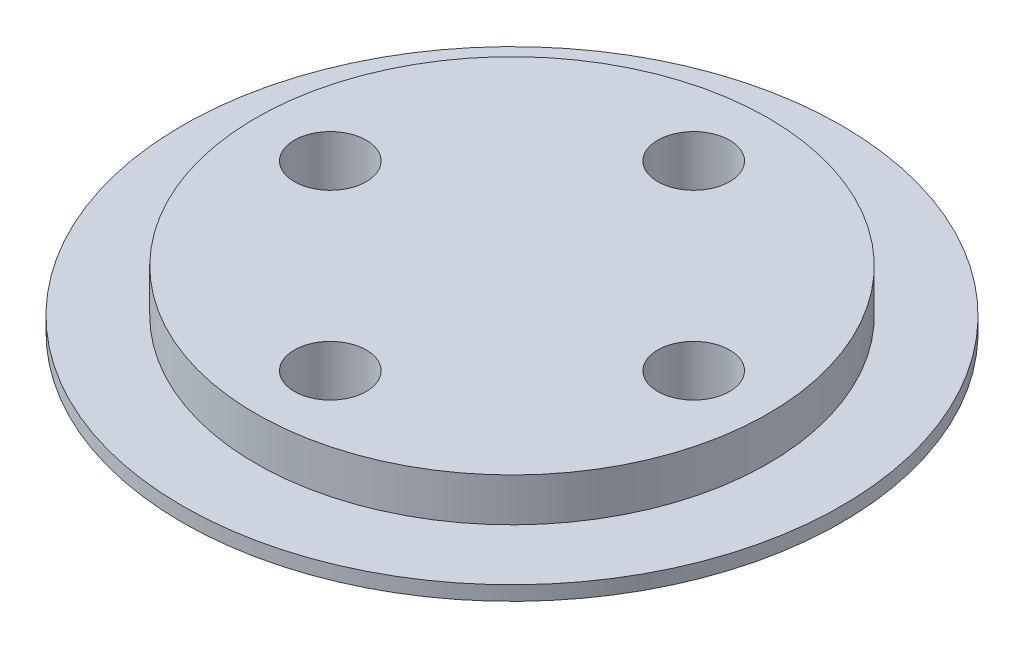
ISO-10303-21;
HEADER;
FILE_DESCRIPTION(('STEP AP214'),'2;1');
FILE_NAME('part.step','',(''),(''),'','','');
FILE_SCHEMA(('AUTOMOTIVE_DESIGN { 1 0 10303 214 1 1 1 1 }'));
ENDSEC;
DATA;
#1=APPLICATION_CONTEXT('core data for automotive mechanical design processes');
#2=APPLICATION_PROTOCOL_DEFINITION('international standard','automotive_design',2000,#1);
#3=PRODUCT_CONTEXT('',#1,'mechanical');
#4=PRODUCT('Part','Part','',(#3));
#5=PRODUCT_RELATED_PRODUCT_CATEGORY('part','',(#4));
#6=PRODUCT_DEFINITION_FORMATION('','',#4);
#7=PRODUCT_DEFINITION_CONTEXT('part definition',#1,'design');
#8=PRODUCT_DEFINITION('design','',#6,#7);
#9=PRODUCT_DEFINITION_SHAPE('','',#8);
#10=(LENGTH_UNIT() NAMED_UNIT(*) SI_UNIT(.MILLI.,.METRE.));
#11=(NAMED_UNIT(*) PLANE_ANGLE_UNIT() SI_UNIT($,.RADIAN.));
#12=(NAMED_UNIT(*) SI_UNIT($,.STERADIAN.) SOLID_ANGLE_UNIT());
#13=UNCERTAINTY_MEASURE_WITH_UNIT(LENGTH_MEASURE(1.E-05),#10,'distance_accuracy_value','');
#14=(GEOMETRIC_REPRESENTATION_CONTEXT(3) GLOBAL_UNCERTAINTY_ASSIGNED_CONTEXT((#13)) GLOBAL_UNIT_ASSIGNED_CONTEXT((#10,
#11,#12)) REPRESENTATION_CONTEXT('',''));
#15=CARTESIAN_POINT('',(0.,0.,0.));
#16=DIRECTION('',(0.,0.,1.));
#17=DIRECTION('',(1.,0.,0.));
#18=AXIS2_PLACEMENT_3D('',#15,#16,#17);
#19=CARTESIAN_POINT('',(114.5,0.,0.));
#20=DIRECTION('',(0.,-1.,0.));
#21=DIRECTION('',(0.,0.,-1.));
#22=AXIS2_PLACEMENT_3D('',#19,#20,#21);
#23=PLANE('',#22);
#24=CARTESIAN_POINT('',(0.,0.,-63.1248529819833));
#25=DIRECTION('',(0.,1.,0.));
#26=DIRECTION('',(0.,0.,1.));
#27=AXIS2_PLACEMENT_3D('',#24,#25,#26);
#28=CIRCLE('',#27,12.5);
#29=CARTESIAN_POINT('',(0.,0.,-50.6248529819833));
#30=VERTEX_POINT('',#29);
#31=EDGE_CURVE('E51',#30,#30,#28,.T.);
#32=ORIENTED_EDGE('',*,*,#31,.T.);
#33=EDGE_LOOP('',(#32));
#34=FACE_BOUND('',#33,.T.);
#35=CARTESIAN_POINT('',(63.1248529819833,0.,2.20399246203811E-13));
#36=DIRECTION('',(0.,1.,0.));
#37=DIRECTION('',(0.,0.,1.));
#38=AXIS2_PLACEMENT_3D('',#35,#36,#37);
#39=CIRCLE('',#38,12.5);
#40=CARTESIAN_POINT('',(63.1248529819833,0.,12.5000000000002));
#41=VERTEX_POINT('',#40);
#42=EDGE_CURVE('E67',#41,#41,#39,.T.);
#43=ORIENTED_EDGE('',*,*,#42,.T.);
#44=EDGE_LOOP('',(#43));
#45=FACE_BOUND('',#44,.T.);
#46=CARTESIAN_POINT('',(3.56548832285789E-12,0.,63.1248529819833));
#47=DIRECTION('',(0.,1.,0.));
#48=DIRECTION('',(0.,0.,1.));
#49=AXIS2_PLACEMENT_3D('',#46,#47,#48);
#50=CIRCLE('',#49,12.5000000000038);
#51=CARTESIAN_POINT('',(3.56548832285789E-12,0.,75.6248529819871));
#52=VERTEX_POINT('',#51);
#53=EDGE_CURVE('E61',#52,#52,#50,.T.);
#54=ORIENTED_EDGE('',*,*,#53,.T.);
#55=EDGE_LOOP('',(#54));
#56=FACE_BOUND('',#55,.T.);
#57=CARTESIAN_POINT('',(-63.1248529819833,0.,-6.61197738611433E-13));
#58=DIRECTION('',(0.,1.,0.));
#59=DIRECTION('',(0.,0.,1.));
#60=AXIS2_PLACEMENT_3D('',#57,#58,#59);
#61=CIRCLE('',#60,12.5);
#62=CARTESIAN_POINT('',(-63.1248529819833,0.,12.4999999999993));
#63=VERTEX_POINT('',#62);
#64=EDGE_CURVE('E55',#63,#63,#61,.T.);
#65=ORIENTED_EDGE('',*,*,#64,.T.);
#66=EDGE_LOOP('',(#65));
#67=FACE_BOUND('',#66,.T.);
#68=CARTESIAN_POINT('',(0.,0.,0.));
#69=DIRECTION('',(0.,-1.,0.));
#70=DIRECTION('',(0.,0.,-1.));
#71=AXIS2_PLACEMENT_3D('',#68,#69,#70);
#72=CIRCLE('',#71,114.5);
#73=CARTESIAN_POINT('',(0.,0.,-114.5));
#74=VERTEX_POINT('',#73);
#75=EDGE_CURVE('E46',#74,#74,#72,.T.);
#76=ORIENTED_EDGE('',*,*,#75,.T.);
#77=EDGE_LOOP('',(#76));
#78=FACE_BOUND('',#77,.T.);
#79=ADVANCED_FACE('F32',(#34,#45,#56,#67,#78),#23,.T.);
#80=CARTESIAN_POINT('',(0.,20.,0.));
#81=DIRECTION('',(0.,1.,0.));
#82=DIRECTION('',(0.,0.,1.));
#83=AXIS2_PLACEMENT_3D('',#80,#81,#82);
#84=PLANE('',#83);
#85=CARTESIAN_POINT('',(0.,20.,-63.1248529819833));
#86=DIRECTION('',(0.,1.,0.));
#87=DIRECTION('',(0.,0.,1.));
#88=AXIS2_PLACEMENT_3D('',#85,#86,#87);
#89=CIRCLE('',#88,12.5);
#90=CARTESIAN_POINT('',(0.,20.,-50.6248529819833));
#91=VERTEX_POINT('',#90);
#92=EDGE_CURVE('E70',#91,#91,#89,.T.);
#93=ORIENTED_EDGE('',*,*,#92,.F.);
#94=EDGE_LOOP('',(#93));
#95=FACE_BOUND('',#94,.T.);
#96=CARTESIAN_POINT('',(63.1248529819833,20.,2.20399246203811E-13));
#97=DIRECTION('',(0.,1.,0.));
#98=DIRECTION('',(0.,0.,1.));
#99=AXIS2_PLACEMENT_3D('',#96,#97,#98);
#100=CIRCLE('',#99,12.5);
#101=CARTESIAN_POINT('',(63.1248529819833,20.,12.5000000000002));
#102=VERTEX_POINT('',#101);
#103=EDGE_CURVE('E64',#102,#102,#100,.T.);
#104=ORIENTED_EDGE('',*,*,#103,.F.);
#105=EDGE_LOOP('',(#104));
#106=FACE_BOUND('',#105,.T.);
#107=CARTESIAN_POINT('',(3.56548832285789E-12,20.,63.1248529819833));
#108=DIRECTION('',(0.,1.,0.));
#109=DIRECTION('',(0.,0.,1.));
#110=AXIS2_PLACEMENT_3D('',#107,#108,#109);
#111=CIRCLE('',#110,12.5000000000038);
#112=CARTESIAN_POINT('',(3.56548832285789E-12,20.,75.6248529819871));
#113=VERTEX_POINT('',#112);
#114=EDGE_CURVE('E58',#113,#113,#111,.T.);
#115=ORIENTED_EDGE('',*,*,#114,.F.);
#116=EDGE_LOOP('',(#115));
#117=FACE_BOUND('',#116,.T.);
#118=CARTESIAN_POINT('',(-63.1248529819833,20.,-6.61197738611433E-13));
#119=DIRECTION('',(0.,1.,0.));
#120=DIRECTION('',(0.,0.,1.));
#121=AXIS2_PLACEMENT_3D('',#118,#119,#120);
#122=CIRCLE('',#121,12.5);
#123=CARTESIAN_POINT('',(-63.1248529819833,20.,12.4999999999993));
#124=VERTEX_POINT('',#123);
#125=EDGE_CURVE('E52',#124,#124,#122,.T.);
#126=ORIENTED_EDGE('',*,*,#125,.F.);
#127=EDGE_LOOP('',(#126));
#128=FACE_BOUND('',#127,.T.);
#129=CARTESIAN_POINT('',(0.,20.,0.));
#130=DIRECTION('',(0.,-1.,0.));
#131=DIRECTION('',(0.,0.,-1.));
#132=AXIS2_PLACEMENT_3D('',#129,#130,#131);
#133=CIRCLE('',#132,89.);
#134=CARTESIAN_POINT('',(0.,20.,-89.));
#135=VERTEX_POINT('',#134);
#136=EDGE_CURVE('E10',#135,#135,#133,.T.);
#137=ORIENTED_EDGE('',*,*,#136,.F.);
#138=EDGE_LOOP('',(#137));
#139=FACE_BOUND('',#138,.T.);
#140=ADVANCED_FACE('F85',(#95,#106,#117,#128,#139),#84,.T.);
#141=CARTESIAN_POINT('',(0.,0.,0.));
#142=DIRECTION('',(0.,-1.,0.));
#143=DIRECTION('',(0.,0.,-1.));
#144=AXIS2_PLACEMENT_3D('',#141,#142,#143);
#145=CYLINDRICAL_SURFACE('',#144,89.);
#146=ORIENTED_EDGE('',*,*,#136,.T.);
#147=EDGE_LOOP('',(#146));
#148=FACE_BOUND('',#147,.T.);
#149=CARTESIAN_POINT('',(0.,5.,0.));
#150=DIRECTION('',(0.,-1.,0.));
#151=DIRECTION('',(0.,0.,-1.));
#152=AXIS2_PLACEMENT_3D('',#149,#150,#151);
#153=CIRCLE('',#152,89.);
#154=CARTESIAN_POINT('',(0.,5.,-89.));
#155=VERTEX_POINT('',#154);
#156=EDGE_CURVE('E38',#155,#155,#153,.T.);
#157=ORIENTED_EDGE('',*,*,#156,.F.);
#158=EDGE_LOOP('',(#157));
#159=FACE_BOUND('',#158,.T.);
#160=ADVANCED_FACE('F88',(#148,#159),#145,.T.);
#161=CARTESIAN_POINT('',(89.,5.,0.));
#162=DIRECTION('',(0.,1.,0.));
#163=DIRECTION('',(0.,0.,1.));
#164=AXIS2_PLACEMENT_3D('',#161,#162,#163);
#165=PLANE('',#164);
#166=ORIENTED_EDGE('',*,*,#156,.T.);
#167=EDGE_LOOP('',(#166));
#168=FACE_BOUND('',#167,.T.);
#169=CARTESIAN_POINT('',(0.,5.,0.));
#170=DIRECTION('',(0.,-1.,0.));
#171=DIRECTION('',(0.,0.,-1.));
#172=AXIS2_PLACEMENT_3D('',#169,#170,#171);
#173=CIRCLE('',#172,114.5);
#174=CARTESIAN_POINT('',(0.,5.,-114.5));
#175=VERTEX_POINT('',#174);
#176=EDGE_CURVE('E42',#175,#175,#173,.T.);
#177=ORIENTED_EDGE('',*,*,#176,.F.);
#178=EDGE_LOOP('',(#177));
#179=FACE_BOUND('',#178,.T.);
#180=ADVANCED_FACE('F108',(#168,#179),#165,.T.);
#181=CARTESIAN_POINT('',(0.,0.,0.));
#182=DIRECTION('',(0.,-1.,0.));
#183=DIRECTION('',(0.,0.,-1.));
#184=AXIS2_PLACEMENT_3D('',#181,#182,#183);
#185=CYLINDRICAL_SURFACE('',#184,114.5);
#186=ORIENTED_EDGE('',*,*,#176,.T.);
#187=EDGE_LOOP('',(#186));
#188=FACE_BOUND('',#187,.T.);
#189=ORIENTED_EDGE('',*,*,#75,.F.);
#190=EDGE_LOOP('',(#189));
#191=FACE_BOUND('',#190,.T.);
#192=ADVANCED_FACE('F99',(#188,#191),#185,.T.);
#193=CARTESIAN_POINT('',(-63.1248529819833,0.,-6.61197738611433E-13));
#194=DIRECTION('',(0.,1.,0.));
#195=DIRECTION('',(0.,0.,1.));
#196=AXIS2_PLACEMENT_3D('',#193,#194,#195);
#197=CYLINDRICAL_SURFACE('',#196,12.5);
#198=ORIENTED_EDGE('',*,*,#64,.F.);
#199=EDGE_LOOP('',(#198));
#200=FACE_BOUND('',#199,.T.);
#201=ORIENTED_EDGE('',*,*,#125,.T.);
#202=EDGE_LOOP('',(#201));
#203=FACE_BOUND('',#202,.T.);
#204=ADVANCED_FACE('F96',(#200,#203),#197,.F.);
#205=CARTESIAN_POINT('',(3.56548832285789E-12,0.,63.1248529819833));
#206=DIRECTION('',(0.,1.,0.));
#207=DIRECTION('',(0.,0.,1.));
#208=AXIS2_PLACEMENT_3D('',#205,#206,#207);
#209=CYLINDRICAL_SURFACE('',#208,12.5000000000038);
#210=ORIENTED_EDGE('',*,*,#53,.F.);
#211=EDGE_LOOP('',(#210));
#212=FACE_BOUND('',#211,.T.);
#213=ORIENTED_EDGE('',*,*,#114,.T.);
#214=EDGE_LOOP('',(#213));
#215=FACE_BOUND('',#214,.T.);
#216=ADVANCED_FACE('F98',(#212,#215),#209,.F.);
#217=CARTESIAN_POINT('',(63.1248529819833,0.,2.20399246203811E-13));
#218=DIRECTION('',(0.,1.,0.));
#219=DIRECTION('',(0.,0.,1.));
#220=AXIS2_PLACEMENT_3D('',#217,#218,#219);
#221=CYLINDRICAL_SURFACE('',#220,12.5);
#222=ORIENTED_EDGE('',*,*,#42,.F.);
#223=EDGE_LOOP('',(#222));
#224=FACE_BOUND('',#223,.T.);
#225=ORIENTED_EDGE('',*,*,#103,.T.);
#226=EDGE_LOOP('',(#225));
#227=FACE_BOUND('',#226,.T.);
#228=ADVANCED_FACE('F81',(#224,#227),#221,.F.);
#229=CARTESIAN_POINT('',(0.,0.,-63.1248529819833));
#230=DIRECTION('',(0.,1.,0.));
#231=DIRECTION('',(0.,0.,1.));
#232=AXIS2_PLACEMENT_3D('',#229,#230,#231);
#233=CYLINDRICAL_SURFACE('',#232,12.5);
#234=ORIENTED_EDGE('',*,*,#31,.F.);
#235=EDGE_LOOP('',(#234));
#236=FACE_BOUND('',#235,.T.);
#237=ORIENTED_EDGE('',*,*,#92,.T.);
#238=EDGE_LOOP('',(#237));
#239=FACE_BOUND('',#238,.T.);
#240=ADVANCED_FACE('F78',(#236,#239),#233,.F.);
#241=CLOSED_SHELL('',(#79,#140,#160,#180,#192,#204,#216,#228,#240));
#242=MANIFOLD_SOLID_BREP('B2',#241);
#243=ADVANCED_BREP_SHAPE_REPRESENTATION('',(#18,#242),#14);
#244=SHAPE_DEFINITION_REPRESENTATION(#9,#243);
ENDSEC;
END-ISO-10303-21;
